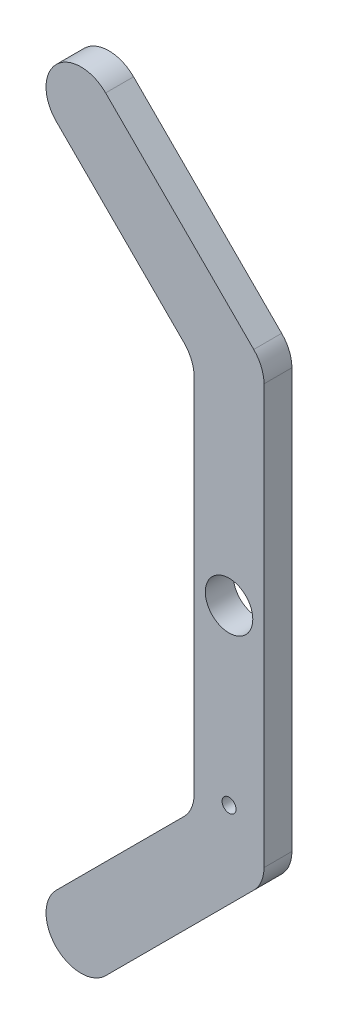
ISO-10303-21;
HEADER;
FILE_DESCRIPTION(('STEP AP214'),'2;1');
FILE_NAME('part.step','',(''),(''),'','','');
FILE_SCHEMA(('AUTOMOTIVE_DESIGN { 1 0 10303 214 1 1 1 1 }'));
ENDSEC;
DATA;
#1=APPLICATION_CONTEXT('core data for automotive mechanical design processes');
#2=APPLICATION_PROTOCOL_DEFINITION('international standard','automotive_design',2000,#1);
#3=PRODUCT_CONTEXT('',#1,'mechanical');
#4=PRODUCT('Part','Part','',(#3));
#5=PRODUCT_RELATED_PRODUCT_CATEGORY('part','',(#4));
#6=PRODUCT_DEFINITION_FORMATION('','',#4);
#7=PRODUCT_DEFINITION_CONTEXT('part definition',#1,'design');
#8=PRODUCT_DEFINITION('design','',#6,#7);
#9=PRODUCT_DEFINITION_SHAPE('','',#8);
#10=(LENGTH_UNIT() NAMED_UNIT(*) SI_UNIT(.MILLI.,.METRE.));
#11=(NAMED_UNIT(*) PLANE_ANGLE_UNIT() SI_UNIT($,.RADIAN.));
#12=(NAMED_UNIT(*) SI_UNIT($,.STERADIAN.) SOLID_ANGLE_UNIT());
#13=UNCERTAINTY_MEASURE_WITH_UNIT(LENGTH_MEASURE(1.E-05),#10,'distance_accuracy_value','');
#14=(GEOMETRIC_REPRESENTATION_CONTEXT(3) GLOBAL_UNCERTAINTY_ASSIGNED_CONTEXT((#13)) GLOBAL_UNIT_ASSIGNED_CONTEXT((#10,
#11,#12)) REPRESENTATION_CONTEXT('',''));
#15=CARTESIAN_POINT('',(0.,0.,0.));
#16=DIRECTION('',(0.,0.,1.));
#17=DIRECTION('',(1.,0.,0.));
#18=AXIS2_PLACEMENT_3D('',#15,#16,#17);
#19=CARTESIAN_POINT('',(0.,6.9999999999999,2.));
#20=DIRECTION('',(0.,0.,-1.));
#21=DIRECTION('',(-1.,0.,0.));
#22=AXIS2_PLACEMENT_3D('',#19,#20,#21);
#23=CYLINDRICAL_SURFACE('',#22,2.5);
#24=CARTESIAN_POINT('',(0.,6.9999999999999,2.));
#25=DIRECTION('',(0.,0.,1.));
#26=DIRECTION('',(1.,0.,0.));
#27=AXIS2_PLACEMENT_3D('',#24,#25,#26);
#28=CIRCLE('',#27,2.5);
#29=CARTESIAN_POINT('',(2.49999999999999,6.9999999999999,2.));
#30=VERTEX_POINT('',#29);
#31=CARTESIAN_POINT('',(1.76776695296636,8.76776695296627,2.));
#32=VERTEX_POINT('',#31);
#33=EDGE_CURVE('E243',#30,#32,#28,.T.);
#34=ORIENTED_EDGE('',*,*,#33,.F.);
#35=DIRECTION('',(0.,0.,-1.));
#36=VECTOR('',#35,1.);
#37=CARTESIAN_POINT('',(2.49999999999999,6.9999999999999,2.));
#38=LINE('',#37,#36);
#39=CARTESIAN_POINT('',(2.49999999999999,6.9999999999999,0.));
#40=VERTEX_POINT('',#39);
#41=EDGE_CURVE('E250',#30,#40,#38,.T.);
#42=ORIENTED_EDGE('',*,*,#41,.T.);
#43=CARTESIAN_POINT('',(0.,6.9999999999999,0.));
#44=DIRECTION('',(0.,0.,1.));
#45=DIRECTION('',(1.,0.,0.));
#46=AXIS2_PLACEMENT_3D('',#43,#44,#45);
#47=CIRCLE('',#46,2.5);
#48=CARTESIAN_POINT('',(1.76776695296636,8.76776695296627,0.));
#49=VERTEX_POINT('',#48);
#50=EDGE_CURVE('E245',#40,#49,#47,.T.);
#51=ORIENTED_EDGE('',*,*,#50,.T.);
#52=DIRECTION('',(0.,0.,-1.));
#53=VECTOR('',#52,1.);
#54=CARTESIAN_POINT('',(1.76776695296636,8.76776695296627,2.));
#55=LINE('',#54,#53);
#56=EDGE_CURVE('E241',#32,#49,#55,.T.);
#57=ORIENTED_EDGE('',*,*,#56,.F.);
#58=EDGE_LOOP('',(#34,#42,#51,#57));
#59=FACE_BOUND('',#58,.T.);
#60=ADVANCED_FACE('F152',(#59),#23,.T.);
#61=CARTESIAN_POINT('',(-10.6066017177982,17.6066017177981,2.));
#62=DIRECTION('',(0.,0.,-1.));
#63=DIRECTION('',(-1.,0.,0.));
#64=AXIS2_PLACEMENT_3D('',#61,#62,#63);
#65=CYLINDRICAL_SURFACE('',#64,2.5);
#66=CARTESIAN_POINT('',(-10.6066017177982,17.6066017177981,0.));
#67=DIRECTION('',(0.,0.,1.));
#68=DIRECTION('',(1.,0.,0.));
#69=AXIS2_PLACEMENT_3D('',#66,#67,#68);
#70=CIRCLE('',#69,2.5);
#71=CARTESIAN_POINT('',(-8.83883476483187,19.3743686707645,0.));
#72=VERTEX_POINT('',#71);
#73=CARTESIAN_POINT('',(-12.3743686707646,15.8388347648317,0.));
#74=VERTEX_POINT('',#73);
#75=EDGE_CURVE('E286',#72,#74,#70,.T.);
#76=ORIENTED_EDGE('',*,*,#75,.T.);
#77=DIRECTION('',(0.,0.,-1.));
#78=VECTOR('',#77,1.);
#79=CARTESIAN_POINT('',(-12.3743686707646,15.8388347648317,2.));
#80=LINE('',#79,#78);
#81=CARTESIAN_POINT('',(-12.3743686707646,15.8388347648317,2.));
#82=VERTEX_POINT('',#81);
#83=EDGE_CURVE('E273',#82,#74,#80,.T.);
#84=ORIENTED_EDGE('',*,*,#83,.F.);
#85=CARTESIAN_POINT('',(-10.6066017177982,17.6066017177981,2.));
#86=DIRECTION('',(0.,0.,1.));
#87=DIRECTION('',(1.,0.,0.));
#88=AXIS2_PLACEMENT_3D('',#85,#86,#87);
#89=CIRCLE('',#88,2.5);
#90=CARTESIAN_POINT('',(-8.83883476483187,19.3743686707645,2.));
#91=VERTEX_POINT('',#90);
#92=EDGE_CURVE('E270',#91,#82,#89,.T.);
#93=ORIENTED_EDGE('',*,*,#92,.F.);
#94=DIRECTION('',(0.,0.,-1.));
#95=VECTOR('',#94,1.);
#96=CARTESIAN_POINT('',(-8.83883476483187,19.3743686707645,2.));
#97=LINE('',#96,#95);
#98=EDGE_CURVE('E251',#91,#72,#97,.T.);
#99=ORIENTED_EDGE('',*,*,#98,.T.);
#100=EDGE_LOOP('',(#76,#84,#93,#99));
#101=FACE_BOUND('',#100,.T.);
#102=ADVANCED_FACE('F415',(#101),#65,.T.);
#103=CARTESIAN_POINT('',(1.73223304703358,1.73223304703359,2.));
#104=DIRECTION('',(-0.707106781186546,-0.707106781186549,0.));
#105=DIRECTION('',(0.707106781186549,-0.707106781186546,0.));
#106=AXIS2_PLACEMENT_3D('',#103,#104,#105);
#107=PLANE('',#106);
#108=DIRECTION('',(-0.707106781186549,0.707106781186546,0.));
#109=VECTOR('',#108,1.);
#110=CARTESIAN_POINT('',(1.73223304703358,1.73223304703359,0.));
#111=LINE('',#110,#109);
#112=CARTESIAN_POINT('',(-3.23223304703364,6.69669914110079,0.));
#113=VERTEX_POINT('',#112);
#114=EDGE_CURVE('E277',#113,#74,#111,.T.);
#115=ORIENTED_EDGE('',*,*,#114,.F.);
#116=DIRECTION('',(0.,0.,-1.));
#117=VECTOR('',#116,1.);
#118=CARTESIAN_POINT('',(-3.23223304703364,6.69669914110079,2.));
#119=LINE('',#118,#117);
#120=CARTESIAN_POINT('',(-3.23223304703364,6.69669914110079,2.));
#121=VERTEX_POINT('',#120);
#122=EDGE_CURVE('E374',#113,#121,#119,.F.);
#123=ORIENTED_EDGE('',*,*,#122,.T.);
#124=DIRECTION('',(-0.707106781186549,0.707106781186546,0.));
#125=VECTOR('',#124,1.);
#126=CARTESIAN_POINT('',(1.73223304703358,1.73223304703359,2.));
#127=LINE('',#126,#125);
#128=EDGE_CURVE('E264',#121,#82,#127,.T.);
#129=ORIENTED_EDGE('',*,*,#128,.T.);
#130=ORIENTED_EDGE('',*,*,#83,.T.);
#131=EDGE_LOOP('',(#115,#123,#129,#130));
#132=FACE_BOUND('',#131,.T.);
#133=ADVANCED_FACE('F424',(#132),#107,.T.);
#134=CARTESIAN_POINT('',(5.26776695296631,5.26776695296633,2.));
#135=DIRECTION('',(-0.707106781186546,-0.707106781186549,0.));
#136=DIRECTION('',(0.707106781186549,-0.707106781186546,0.));
#137=AXIS2_PLACEMENT_3D('',#134,#135,#136);
#138=PLANE('',#137);
#139=DIRECTION('',(-0.707106781186549,0.707106781186546,0.));
#140=VECTOR('',#139,1.);
#141=CARTESIAN_POINT('',(5.26776695296631,5.26776695296633,0.));
#142=LINE('',#141,#140);
#143=EDGE_CURVE('E283',#49,#72,#142,.T.);
#144=ORIENTED_EDGE('',*,*,#143,.T.);
#145=ORIENTED_EDGE('',*,*,#98,.F.);
#146=DIRECTION('',(-0.707106781186549,0.707106781186546,0.));
#147=VECTOR('',#146,1.);
#148=CARTESIAN_POINT('',(5.26776695296631,5.26776695296633,2.));
#149=LINE('',#148,#147);
#150=EDGE_CURVE('E258',#32,#91,#149,.T.);
#151=ORIENTED_EDGE('',*,*,#150,.F.);
#152=ORIENTED_EDGE('',*,*,#56,.T.);
#153=EDGE_LOOP('',(#144,#145,#151,#152));
#154=FACE_BOUND('',#153,.T.);
#155=ADVANCED_FACE('F266',(#154),#138,.F.);
#156=CARTESIAN_POINT('',(0.,0.,0.));
#157=DIRECTION('',(0.,0.,1.));
#158=DIRECTION('',(1.,0.,0.));
#159=AXIS2_PLACEMENT_3D('',#156,#157,#158);
#160=PLANE('',#159);
#161=CARTESIAN_POINT('',(0.,-20.3790818780436,0.));
#162=DIRECTION('',(0.,0.,1.));
#163=DIRECTION('',(1.,0.,0.));
#164=AXIS2_PLACEMENT_3D('',#161,#162,#163);
#165=CIRCLE('',#164,0.5);
#166=CARTESIAN_POINT('',(0.5,-20.3790818780436,0.));
#167=VERTEX_POINT('',#166);
#168=EDGE_CURVE('E326',#167,#167,#165,.T.);
#169=ORIENTED_EDGE('',*,*,#168,.T.);
#170=EDGE_LOOP('',(#169));
#171=FACE_BOUND('',#170,.T.);
#172=DIRECTION('',(-0.707106781186544,-0.707106781186551,0.));
#173=VECTOR('',#172,1.);
#174=CARTESIAN_POINT('',(9.73223304703368,-9.73223304703357,0.));
#175=LINE('',#174,#173);
#176=CARTESIAN_POINT('',(-3.23223304703362,-22.696699141101,0.));
#177=VERTEX_POINT('',#176);
#178=CARTESIAN_POINT('',(-12.3743686707645,-31.838834764832,0.));
#179=VERTEX_POINT('',#178);
#180=EDGE_CURVE('E334',#177,#179,#175,.T.);
#181=ORIENTED_EDGE('',*,*,#180,.F.);
#182=CARTESIAN_POINT('',(-5.,-20.9289321881347,0.));
#183=DIRECTION('',(0.,0.,1.));
#184=DIRECTION('',(1.,0.,0.));
#185=AXIS2_PLACEMENT_3D('',#182,#183,#184);
#186=CIRCLE('',#185,2.5);
#187=CARTESIAN_POINT('',(-2.5,-20.9289321881347,0.));
#188=VERTEX_POINT('',#187);
#189=EDGE_CURVE('E161',#177,#188,#186,.T.);
#190=ORIENTED_EDGE('',*,*,#189,.T.);
#191=DIRECTION('',(0.,1.,0.));
#192=VECTOR('',#191,1.);
#193=CARTESIAN_POINT('',(-2.5,0.,0.));
#194=LINE('',#193,#192);
#195=CARTESIAN_POINT('',(-2.5,4.92893218813442,0.));
#196=VERTEX_POINT('',#195);
#197=EDGE_CURVE('E330',#188,#196,#194,.T.);
#198=ORIENTED_EDGE('',*,*,#197,.T.);
#199=CARTESIAN_POINT('',(-5.00000000000001,4.92893218813441,0.));
#200=DIRECTION('',(0.,0.,1.));
#201=DIRECTION('',(1.,0.,0.));
#202=AXIS2_PLACEMENT_3D('',#199,#200,#201);
#203=CIRCLE('',#202,2.5);
#204=EDGE_CURVE('E380',#196,#113,#203,.T.);
#205=ORIENTED_EDGE('',*,*,#204,.T.);
#206=ORIENTED_EDGE('',*,*,#114,.T.);
#207=ORIENTED_EDGE('',*,*,#75,.F.);
#208=ORIENTED_EDGE('',*,*,#143,.F.);
#209=ORIENTED_EDGE('',*,*,#50,.F.);
#210=DIRECTION('',(0.,1.,0.));
#211=VECTOR('',#210,1.);
#212=CARTESIAN_POINT('',(2.5,-23.0000000000001,0.));
#213=LINE('',#212,#211);
#214=CARTESIAN_POINT('',(2.5,-23.0000000000001,0.));
#215=VERTEX_POINT('',#214);
#216=EDGE_CURVE('E355',#215,#40,#213,.T.);
#217=ORIENTED_EDGE('',*,*,#216,.F.);
#218=CARTESIAN_POINT('',(0.,-23.0000000000001,0.));
#219=DIRECTION('',(0.,0.,1.));
#220=DIRECTION('',(1.,0.,0.));
#221=AXIS2_PLACEMENT_3D('',#218,#219,#220);
#222=CIRCLE('',#221,2.5);
#223=CARTESIAN_POINT('',(1.76776695296638,-24.7677669529665,0.));
#224=VERTEX_POINT('',#223);
#225=EDGE_CURVE('E322',#224,#215,#222,.T.);
#226=ORIENTED_EDGE('',*,*,#225,.F.);
#227=DIRECTION('',(-0.707106781186544,-0.707106781186551,0.));
#228=VECTOR('',#227,1.);
#229=CARTESIAN_POINT('',(13.2677669529664,-13.2677669529663,0.));
#230=LINE('',#229,#228);
#231=CARTESIAN_POINT('',(-8.83883476483177,-35.3743686707647,0.));
#232=VERTEX_POINT('',#231);
#233=EDGE_CURVE('E318',#224,#232,#230,.T.);
#234=ORIENTED_EDGE('',*,*,#233,.T.);
#235=CARTESIAN_POINT('',(-10.6066017177982,-33.6066017177984,0.));
#236=DIRECTION('',(0.,0.,1.));
#237=DIRECTION('',(1.,0.,0.));
#238=AXIS2_PLACEMENT_3D('',#235,#236,#237);
#239=CIRCLE('',#238,2.5);
#240=EDGE_CURVE('E300',#179,#232,#239,.T.);
#241=ORIENTED_EDGE('',*,*,#240,.F.);
#242=EDGE_LOOP('',(#181,#190,#198,#205,#206,#207,#208,#209,#217,#226,#234,#241));
#243=FACE_BOUND('',#242,.T.);
#244=CARTESIAN_POINT('',(0.,-8.0000000000001,0.));
#245=DIRECTION('',(0.,0.,1.));
#246=DIRECTION('',(1.,0.,0.));
#247=AXIS2_PLACEMENT_3D('',#244,#245,#246);
#248=CIRCLE('',#247,1.7);
#249=CARTESIAN_POINT('',(1.7,-8.0000000000001,0.));
#250=VERTEX_POINT('',#249);
#251=EDGE_CURVE('E356',#250,#250,#248,.T.);
#252=ORIENTED_EDGE('',*,*,#251,.T.);
#253=EDGE_LOOP('',(#252));
#254=FACE_BOUND('',#253,.T.);
#255=ADVANCED_FACE('F389',(#171,#243,#254),#160,.F.);
#256=CARTESIAN_POINT('',(0.,0.,2.));
#257=DIRECTION('',(0.,0.,1.));
#258=DIRECTION('',(1.,0.,0.));
#259=AXIS2_PLACEMENT_3D('',#256,#257,#258);
#260=PLANE('',#259);
#261=CARTESIAN_POINT('',(0.,-20.3790818780436,2.));
#262=DIRECTION('',(0.,0.,1.));
#263=DIRECTION('',(1.,0.,0.));
#264=AXIS2_PLACEMENT_3D('',#261,#262,#263);
#265=CIRCLE('',#264,0.5);
#266=CARTESIAN_POINT('',(0.5,-20.3790818780436,2.));
#267=VERTEX_POINT('',#266);
#268=EDGE_CURVE('E303',#267,#267,#265,.T.);
#269=ORIENTED_EDGE('',*,*,#268,.F.);
#270=EDGE_LOOP('',(#269));
#271=FACE_BOUND('',#270,.T.);
#272=ORIENTED_EDGE('',*,*,#128,.F.);
#273=CARTESIAN_POINT('',(-5.00000000000001,4.92893218813441,2.));
#274=DIRECTION('',(0.,0.,1.));
#275=DIRECTION('',(1.,0.,0.));
#276=AXIS2_PLACEMENT_3D('',#273,#274,#275);
#277=CIRCLE('',#276,2.5);
#278=CARTESIAN_POINT('',(-2.5,4.92893218813442,2.));
#279=VERTEX_POINT('',#278);
#280=EDGE_CURVE('E383',#121,#279,#277,.F.);
#281=ORIENTED_EDGE('',*,*,#280,.T.);
#282=DIRECTION('',(0.,1.,0.));
#283=VECTOR('',#282,1.);
#284=CARTESIAN_POINT('',(-2.5,0.,2.));
#285=LINE('',#284,#283);
#286=CARTESIAN_POINT('',(-2.5,-20.9289321881347,2.));
#287=VERTEX_POINT('',#286);
#288=EDGE_CURVE('E307',#287,#279,#285,.T.);
#289=ORIENTED_EDGE('',*,*,#288,.F.);
#290=CARTESIAN_POINT('',(-5.,-20.9289321881347,2.));
#291=DIRECTION('',(0.,0.,1.));
#292=DIRECTION('',(1.,0.,0.));
#293=AXIS2_PLACEMENT_3D('',#290,#291,#292);
#294=CIRCLE('',#293,2.5);
#295=CARTESIAN_POINT('',(-3.23223304703362,-22.696699141101,2.));
#296=VERTEX_POINT('',#295);
#297=EDGE_CURVE('E12',#287,#296,#294,.F.);
#298=ORIENTED_EDGE('',*,*,#297,.T.);
#299=DIRECTION('',(-0.707106781186544,-0.707106781186551,0.));
#300=VECTOR('',#299,1.);
#301=CARTESIAN_POINT('',(9.73223304703368,-9.73223304703357,2.));
#302=LINE('',#301,#300);
#303=CARTESIAN_POINT('',(-12.3743686707645,-31.838834764832,2.));
#304=VERTEX_POINT('',#303);
#305=EDGE_CURVE('E311',#296,#304,#302,.T.);
#306=ORIENTED_EDGE('',*,*,#305,.T.);
#307=CARTESIAN_POINT('',(-10.6066017177982,-33.6066017177984,2.));
#308=DIRECTION('',(0.,0.,1.));
#309=DIRECTION('',(1.,0.,0.));
#310=AXIS2_PLACEMENT_3D('',#307,#308,#309);
#311=CIRCLE('',#310,2.5);
#312=CARTESIAN_POINT('',(-8.83883476483177,-35.3743686707647,2.));
#313=VERTEX_POINT('',#312);
#314=EDGE_CURVE('E314',#304,#313,#311,.T.);
#315=ORIENTED_EDGE('',*,*,#314,.T.);
#316=DIRECTION('',(-0.707106781186544,-0.707106781186551,0.));
#317=VECTOR('',#316,1.);
#318=CARTESIAN_POINT('',(13.2677669529664,-13.2677669529663,2.));
#319=LINE('',#318,#317);
#320=CARTESIAN_POINT('',(1.76776695296638,-24.7677669529665,2.));
#321=VERTEX_POINT('',#320);
#322=EDGE_CURVE('E295',#321,#313,#319,.T.);
#323=ORIENTED_EDGE('',*,*,#322,.F.);
#324=CARTESIAN_POINT('',(0.,-23.0000000000001,2.));
#325=DIRECTION('',(0.,0.,1.));
#326=DIRECTION('',(1.,0.,0.));
#327=AXIS2_PLACEMENT_3D('',#324,#325,#326);
#328=CIRCLE('',#327,2.5);
#329=CARTESIAN_POINT('',(2.5,-23.0000000000001,2.));
#330=VERTEX_POINT('',#329);
#331=EDGE_CURVE('E299',#321,#330,#328,.T.);
#332=ORIENTED_EDGE('',*,*,#331,.T.);
#333=DIRECTION('',(0.,1.,0.));
#334=VECTOR('',#333,1.);
#335=CARTESIAN_POINT('',(2.5,-23.0000000000001,2.));
#336=LINE('',#335,#334);
#337=EDGE_CURVE('E262',#330,#30,#336,.T.);
#338=ORIENTED_EDGE('',*,*,#337,.T.);
#339=ORIENTED_EDGE('',*,*,#33,.T.);
#340=ORIENTED_EDGE('',*,*,#150,.T.);
#341=ORIENTED_EDGE('',*,*,#92,.T.);
#342=EDGE_LOOP('',(#272,#281,#289,#298,#306,#315,#323,#332,#338,#339,#340,#341));
#343=FACE_BOUND('',#342,.T.);
#344=CARTESIAN_POINT('',(0.,-8.0000000000001,2.));
#345=DIRECTION('',(0.,0.,1.));
#346=DIRECTION('',(1.,0.,0.));
#347=AXIS2_PLACEMENT_3D('',#344,#345,#346);
#348=CIRCLE('',#347,1.7);
#349=CARTESIAN_POINT('',(1.7,-8.0000000000001,2.));
#350=VERTEX_POINT('',#349);
#351=EDGE_CURVE('E351',#350,#350,#348,.T.);
#352=ORIENTED_EDGE('',*,*,#351,.F.);
#353=EDGE_LOOP('',(#352));
#354=FACE_BOUND('',#353,.T.);
#355=ADVANCED_FACE('F255',(#271,#343,#354),#260,.T.);
#356=CARTESIAN_POINT('',(-10.6066017177982,-33.6066017177984,2.));
#357=DIRECTION('',(0.,0.,-1.));
#358=DIRECTION('',(-1.,0.,0.));
#359=AXIS2_PLACEMENT_3D('',#356,#357,#358);
#360=CYLINDRICAL_SURFACE('',#359,2.5);
#361=ORIENTED_EDGE('',*,*,#240,.T.);
#362=DIRECTION('',(0.,0.,-1.));
#363=VECTOR('',#362,1.);
#364=CARTESIAN_POINT('',(-8.83883476483177,-35.3743686707647,2.));
#365=LINE('',#364,#363);
#366=EDGE_CURVE('E317',#313,#232,#365,.T.);
#367=ORIENTED_EDGE('',*,*,#366,.F.);
#368=ORIENTED_EDGE('',*,*,#314,.F.);
#369=DIRECTION('',(0.,0.,-1.));
#370=VECTOR('',#369,1.);
#371=CARTESIAN_POINT('',(-12.3743686707645,-31.838834764832,2.));
#372=LINE('',#371,#370);
#373=EDGE_CURVE('E342',#304,#179,#372,.T.);
#374=ORIENTED_EDGE('',*,*,#373,.T.);
#375=EDGE_LOOP('',(#361,#367,#368,#374));
#376=FACE_BOUND('',#375,.T.);
#377=ADVANCED_FACE('F402',(#376),#360,.T.);
#378=CARTESIAN_POINT('',(9.73223304703368,-9.73223304703357,2.));
#379=DIRECTION('',(0.707106781186552,-0.707106781186544,0.));
#380=DIRECTION('',(0.707106781186544,0.707106781186551,0.));
#381=AXIS2_PLACEMENT_3D('',#378,#379,#380);
#382=PLANE('',#381);
#383=ORIENTED_EDGE('',*,*,#305,.F.);
#384=DIRECTION('',(0.,0.,-1.));
#385=VECTOR('',#384,1.);
#386=CARTESIAN_POINT('',(-3.23223304703362,-22.696699141101,2.));
#387=LINE('',#386,#385);
#388=EDGE_CURVE('E377',#296,#177,#387,.T.);
#389=ORIENTED_EDGE('',*,*,#388,.T.);
#390=ORIENTED_EDGE('',*,*,#180,.T.);
#391=ORIENTED_EDGE('',*,*,#373,.F.);
#392=EDGE_LOOP('',(#383,#389,#390,#391));
#393=FACE_BOUND('',#392,.T.);
#394=ADVANCED_FACE('F396',(#393),#382,.F.);
#395=CARTESIAN_POINT('',(13.2677669529664,-13.2677669529663,2.));
#396=DIRECTION('',(0.707106781186551,-0.707106781186544,0.));
#397=DIRECTION('',(0.707106781186544,0.707106781186551,0.));
#398=AXIS2_PLACEMENT_3D('',#395,#396,#397);
#399=PLANE('',#398);
#400=ORIENTED_EDGE('',*,*,#233,.F.);
#401=DIRECTION('',(0.,0.,-1.));
#402=VECTOR('',#401,1.);
#403=CARTESIAN_POINT('',(1.76776695296638,-24.7677669529665,2.));
#404=LINE('',#403,#402);
#405=EDGE_CURVE('E346',#321,#224,#404,.T.);
#406=ORIENTED_EDGE('',*,*,#405,.F.);
#407=ORIENTED_EDGE('',*,*,#322,.T.);
#408=ORIENTED_EDGE('',*,*,#366,.T.);
#409=EDGE_LOOP('',(#400,#406,#407,#408));
#410=FACE_BOUND('',#409,.T.);
#411=ADVANCED_FACE('F405',(#410),#399,.T.);
#412=CARTESIAN_POINT('',(0.,-20.3790818780436,2.));
#413=DIRECTION('',(0.,0.,-1.));
#414=DIRECTION('',(-1.,0.,0.));
#415=AXIS2_PLACEMENT_3D('',#412,#413,#414);
#416=CYLINDRICAL_SURFACE('',#415,0.5);
#417=ORIENTED_EDGE('',*,*,#168,.F.);
#418=EDGE_LOOP('',(#417));
#419=FACE_BOUND('',#418,.T.);
#420=ORIENTED_EDGE('',*,*,#268,.T.);
#421=EDGE_LOOP('',(#420));
#422=FACE_BOUND('',#421,.T.);
#423=ADVANCED_FACE('F441',(#419,#422),#416,.F.);
#424=CARTESIAN_POINT('',(-2.5,0.,2.));
#425=DIRECTION('',(-1.,0.,0.));
#426=DIRECTION('',(0.,-1.,0.));
#427=AXIS2_PLACEMENT_3D('',#424,#425,#426);
#428=PLANE('',#427);
#429=ORIENTED_EDGE('',*,*,#288,.T.);
#430=DIRECTION('',(0.,0.,-1.));
#431=VECTOR('',#430,1.);
#432=CARTESIAN_POINT('',(-2.5,4.92893218813442,0.));
#433=LINE('',#432,#431);
#434=EDGE_CURVE('E370',#279,#196,#433,.T.);
#435=ORIENTED_EDGE('',*,*,#434,.T.);
#436=ORIENTED_EDGE('',*,*,#197,.F.);
#437=DIRECTION('',(0.,0.,-1.));
#438=VECTOR('',#437,1.);
#439=CARTESIAN_POINT('',(-2.5,-20.9289321881347,2.));
#440=LINE('',#439,#438);
#441=EDGE_CURVE('E367',#188,#287,#440,.F.);
#442=ORIENTED_EDGE('',*,*,#441,.T.);
#443=EDGE_LOOP('',(#429,#435,#436,#442));
#444=FACE_BOUND('',#443,.T.);
#445=ADVANCED_FACE('F393',(#444),#428,.T.);
#446=CARTESIAN_POINT('',(0.,-23.0000000000001,2.));
#447=DIRECTION('',(0.,0.,-1.));
#448=DIRECTION('',(-1.,0.,0.));
#449=AXIS2_PLACEMENT_3D('',#446,#447,#448);
#450=CYLINDRICAL_SURFACE('',#449,2.5);
#451=DIRECTION('',(0.,0.,-1.));
#452=VECTOR('',#451,1.);
#453=CARTESIAN_POINT('',(2.5,-23.0000000000001,2.));
#454=LINE('',#453,#452);
#455=EDGE_CURVE('E280',#330,#215,#454,.T.);
#456=ORIENTED_EDGE('',*,*,#455,.F.);
#457=ORIENTED_EDGE('',*,*,#331,.F.);
#458=ORIENTED_EDGE('',*,*,#405,.T.);
#459=ORIENTED_EDGE('',*,*,#225,.T.);
#460=EDGE_LOOP('',(#456,#457,#458,#459));
#461=FACE_BOUND('',#460,.T.);
#462=ADVANCED_FACE('F409',(#461),#450,.T.);
#463=CARTESIAN_POINT('',(0.,-8.0000000000001,2.));
#464=DIRECTION('',(0.,0.,-1.));
#465=DIRECTION('',(-1.,0.,0.));
#466=AXIS2_PLACEMENT_3D('',#463,#464,#465);
#467=CYLINDRICAL_SURFACE('',#466,1.7);
#468=ORIENTED_EDGE('',*,*,#351,.T.);
#469=EDGE_LOOP('',(#468));
#470=FACE_BOUND('',#469,.T.);
#471=ORIENTED_EDGE('',*,*,#251,.F.);
#472=EDGE_LOOP('',(#471));
#473=FACE_BOUND('',#472,.T.);
#474=ADVANCED_FACE('F447',(#470,#473),#467,.F.);
#475=CARTESIAN_POINT('',(2.5,-23.0000000000001,2.));
#476=DIRECTION('',(-1.,0.,0.));
#477=DIRECTION('',(0.,-1.,0.));
#478=AXIS2_PLACEMENT_3D('',#475,#476,#477);
#479=PLANE('',#478);
#480=ORIENTED_EDGE('',*,*,#216,.T.);
#481=ORIENTED_EDGE('',*,*,#41,.F.);
#482=ORIENTED_EDGE('',*,*,#337,.F.);
#483=ORIENTED_EDGE('',*,*,#455,.T.);
#484=EDGE_LOOP('',(#480,#481,#482,#483));
#485=FACE_BOUND('',#484,.T.);
#486=ADVANCED_FACE('F412',(#485),#479,.F.);
#487=CARTESIAN_POINT('',(-5.00000000000001,4.92893218813441,2.));
#488=DIRECTION('',(0.,0.,1.));
#489=DIRECTION('',(1.,0.,0.));
#490=AXIS2_PLACEMENT_3D('',#487,#488,#489);
#491=CYLINDRICAL_SURFACE('',#490,2.5);
#492=ORIENTED_EDGE('',*,*,#280,.F.);
#493=ORIENTED_EDGE('',*,*,#122,.F.);
#494=ORIENTED_EDGE('',*,*,#204,.F.);
#495=ORIENTED_EDGE('',*,*,#434,.F.);
#496=EDGE_LOOP('',(#492,#493,#494,#495));
#497=FACE_BOUND('',#496,.T.);
#498=ADVANCED_FACE('F422',(#497),#491,.F.);
#499=CARTESIAN_POINT('',(-5.,-20.9289321881347,2.));
#500=DIRECTION('',(0.,0.,-1.));
#501=DIRECTION('',(-1.,0.,0.));
#502=AXIS2_PLACEMENT_3D('',#499,#500,#501);
#503=CYLINDRICAL_SURFACE('',#502,2.5);
#504=ORIENTED_EDGE('',*,*,#297,.F.);
#505=ORIENTED_EDGE('',*,*,#441,.F.);
#506=ORIENTED_EDGE('',*,*,#189,.F.);
#507=ORIENTED_EDGE('',*,*,#388,.F.);
#508=EDGE_LOOP('',(#504,#505,#506,#507));
#509=FACE_BOUND('',#508,.T.);
#510=ADVANCED_FACE('F154',(#509),#503,.F.);
#511=CLOSED_SHELL('',(#60,#102,#133,#155,#255,#355,#377,#394,#411,#423,#445,#462,#474,#486,#498,#510));
#512=MANIFOLD_SOLID_BREP('B2',#511);
#513=ADVANCED_BREP_SHAPE_REPRESENTATION('',(#18,#512),#14);
#514=SHAPE_DEFINITION_REPRESENTATION(#9,#513);
ENDSEC;
END-ISO-10303-21;
